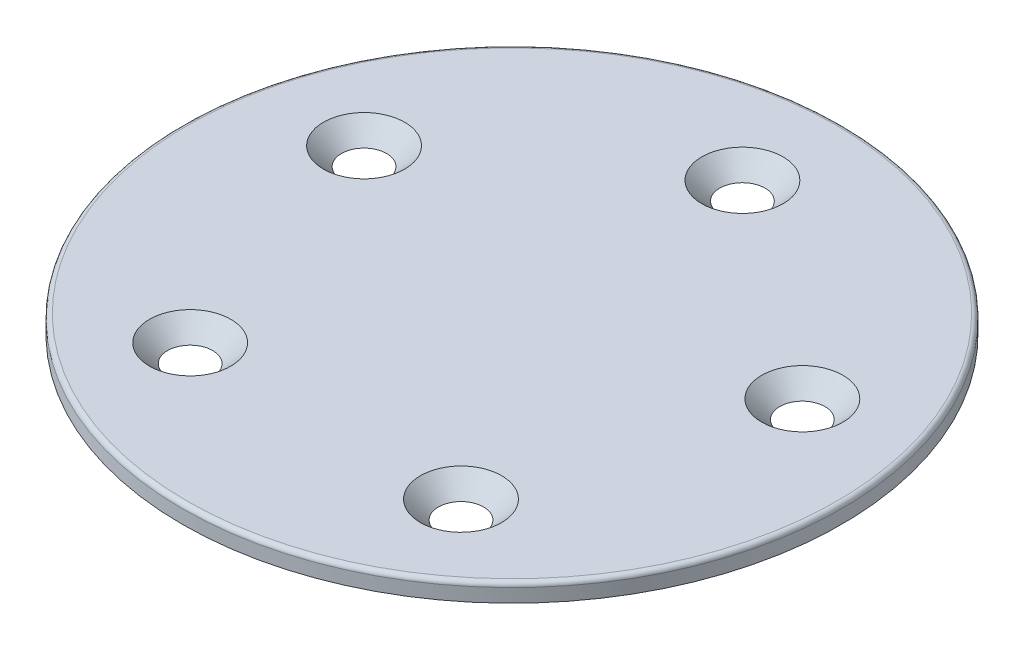
ISO-10303-21;
HEADER;
FILE_DESCRIPTION(('STEP AP214'),'2;1');
FILE_NAME('part.step','',(''),(''),'','','');
FILE_SCHEMA(('AUTOMOTIVE_DESIGN { 1 0 10303 214 1 1 1 1 }'));
ENDSEC;
DATA;
#1=APPLICATION_CONTEXT('core data for automotive mechanical design processes');
#2=APPLICATION_PROTOCOL_DEFINITION('international standard','automotive_design',2000,#1);
#3=PRODUCT_CONTEXT('',#1,'mechanical');
#4=PRODUCT('Part','Part','',(#3));
#5=PRODUCT_RELATED_PRODUCT_CATEGORY('part','',(#4));
#6=PRODUCT_DEFINITION_FORMATION('','',#4);
#7=PRODUCT_DEFINITION_CONTEXT('part definition',#1,'design');
#8=PRODUCT_DEFINITION('design','',#6,#7);
#9=PRODUCT_DEFINITION_SHAPE('','',#8);
#10=(LENGTH_UNIT() NAMED_UNIT(*) SI_UNIT(.MILLI.,.METRE.));
#11=(NAMED_UNIT(*) PLANE_ANGLE_UNIT() SI_UNIT($,.RADIAN.));
#12=(NAMED_UNIT(*) SI_UNIT($,.STERADIAN.) SOLID_ANGLE_UNIT());
#13=UNCERTAINTY_MEASURE_WITH_UNIT(LENGTH_MEASURE(1.E-05),#10,'distance_accuracy_value','');
#14=(GEOMETRIC_REPRESENTATION_CONTEXT(3) GLOBAL_UNCERTAINTY_ASSIGNED_CONTEXT((#13)) GLOBAL_UNIT_ASSIGNED_CONTEXT((#10,
#11,#12)) REPRESENTATION_CONTEXT('',''));
#15=CARTESIAN_POINT('',(0.,0.,0.));
#16=DIRECTION('',(0.,0.,1.));
#17=DIRECTION('',(1.,0.,0.));
#18=AXIS2_PLACEMENT_3D('',#15,#16,#17);
#19=CARTESIAN_POINT('',(0.,2.,0.));
#20=DIRECTION('',(0.,-1.,0.));
#21=DIRECTION('',(0.,0.,-1.));
#22=AXIS2_PLACEMENT_3D('',#19,#20,#21);
#23=CYLINDRICAL_SURFACE('',#22,36.5);
#24=CARTESIAN_POINT('',(0.,1.5,0.));
#25=DIRECTION('',(0.,1.,0.));
#26=DIRECTION('',(0.,0.,1.));
#27=AXIS2_PLACEMENT_3D('',#24,#25,#26);
#28=CIRCLE('',#27,36.5);
#29=CARTESIAN_POINT('',(0.,1.5,36.5));
#30=VERTEX_POINT('',#29);
#31=EDGE_CURVE('E10',#30,#30,#28,.F.);
#32=ORIENTED_EDGE('',*,*,#31,.T.);
#33=EDGE_LOOP('',(#32));
#34=FACE_BOUND('',#33,.T.);
#35=CARTESIAN_POINT('',(0.,0.,0.));
#36=DIRECTION('',(0.,1.,0.));
#37=DIRECTION('',(0.,0.,1.));
#38=AXIS2_PLACEMENT_3D('',#35,#36,#37);
#39=CIRCLE('',#38,36.5);
#40=CARTESIAN_POINT('',(0.,0.,36.5));
#41=VERTEX_POINT('',#40);
#42=EDGE_CURVE('E83',#41,#41,#39,.T.);
#43=ORIENTED_EDGE('',*,*,#42,.T.);
#44=EDGE_LOOP('',(#43));
#45=FACE_BOUND('',#44,.T.);
#46=ADVANCED_FACE('F47',(#34,#45),#23,.T.);
#47=CARTESIAN_POINT('',(0.,2.,0.));
#48=DIRECTION('',(0.,1.,0.));
#49=DIRECTION('',(0.,0.,1.));
#50=AXIS2_PLACEMENT_3D('',#47,#48,#49);
#51=PLANE('',#50);
#52=CARTESIAN_POINT('',(0.,2.,0.));
#53=DIRECTION('',(0.,1.,0.));
#54=DIRECTION('',(0.,0.,1.));
#55=AXIS2_PLACEMENT_3D('',#52,#53,#54);
#56=CIRCLE('',#55,36.);
#57=CARTESIAN_POINT('',(0.,2.,36.));
#58=VERTEX_POINT('',#57);
#59=EDGE_CURVE('E55',#58,#58,#56,.T.);
#60=ORIENTED_EDGE('',*,*,#59,.T.);
#61=EDGE_LOOP('',(#60));
#62=FACE_BOUND('',#61,.T.);
#63=CARTESIAN_POINT('',(-15.0002796385039,2.,20.6461136964487));
#64=DIRECTION('',(0.,1.,0.));
#65=DIRECTION('',(0.,0.,1.));
#66=AXIS2_PLACEMENT_3D('',#63,#64,#65);
#67=CIRCLE('',#66,4.50000000000004);
#68=CARTESIAN_POINT('',(-15.0002796385039,2.,25.1461136964487));
#69=VERTEX_POINT('',#68);
#70=EDGE_CURVE('E60',#69,#69,#67,.F.);
#71=ORIENTED_EDGE('',*,*,#70,.T.);
#72=EDGE_LOOP('',(#71));
#73=FACE_BOUND('',#72,.T.);
#74=CARTESIAN_POINT('',(15.0002796385039,2.,20.6461136964487));
#75=DIRECTION('',(0.,1.,0.));
#76=DIRECTION('',(0.,0.,1.));
#77=AXIS2_PLACEMENT_3D('',#74,#75,#76);
#78=CIRCLE('',#77,4.5);
#79=CARTESIAN_POINT('',(15.0002796385039,2.,25.1461136964487));
#80=VERTEX_POINT('',#79);
#81=EDGE_CURVE('E65',#80,#80,#78,.F.);
#82=ORIENTED_EDGE('',*,*,#81,.T.);
#83=EDGE_LOOP('',(#82));
#84=FACE_BOUND('',#83,.T.);
#85=CARTESIAN_POINT('',(24.2709622958523,2.,-7.88611369644866));
#86=DIRECTION('',(0.,1.,0.));
#87=DIRECTION('',(0.,0.,1.));
#88=AXIS2_PLACEMENT_3D('',#85,#86,#87);
#89=CIRCLE('',#88,4.50000000000003);
#90=CARTESIAN_POINT('',(24.2709622958523,2.,-3.38611369644863));
#91=VERTEX_POINT('',#90);
#92=EDGE_CURVE('E71',#91,#91,#89,.F.);
#93=ORIENTED_EDGE('',*,*,#92,.T.);
#94=EDGE_LOOP('',(#93));
#95=FACE_BOUND('',#94,.T.);
#96=CARTESIAN_POINT('',(0.,2.,-25.52));
#97=DIRECTION('',(0.,1.,0.));
#98=DIRECTION('',(0.,0.,1.));
#99=AXIS2_PLACEMENT_3D('',#96,#97,#98);
#100=CIRCLE('',#99,4.5);
#101=CARTESIAN_POINT('',(0.,2.,-21.02));
#102=VERTEX_POINT('',#101);
#103=EDGE_CURVE('E75',#102,#102,#100,.F.);
#104=ORIENTED_EDGE('',*,*,#103,.T.);
#105=EDGE_LOOP('',(#104));
#106=FACE_BOUND('',#105,.T.);
#107=CARTESIAN_POINT('',(-24.2709622958523,2.,-7.88611369644866));
#108=DIRECTION('',(0.,1.,0.));
#109=DIRECTION('',(0.,0.,1.));
#110=AXIS2_PLACEMENT_3D('',#107,#108,#109);
#111=CIRCLE('',#110,4.50000000000003);
#112=CARTESIAN_POINT('',(-24.2709622958523,2.,-3.38611369644863));
#113=VERTEX_POINT('',#112);
#114=EDGE_CURVE('E79',#113,#113,#111,.F.);
#115=ORIENTED_EDGE('',*,*,#114,.T.);
#116=EDGE_LOOP('',(#115));
#117=FACE_BOUND('',#116,.T.);
#118=ADVANCED_FACE('F126',(#62,#73,#84,#95,#106,#117),#51,.T.);
#119=CARTESIAN_POINT('',(0.,0.,0.));
#120=DIRECTION('',(0.,1.,0.));
#121=DIRECTION('',(0.,0.,1.));
#122=AXIS2_PLACEMENT_3D('',#119,#120,#121);
#123=PLANE('',#122);
#124=CARTESIAN_POINT('',(-24.2709622958523,0.,-7.88611369644866));
#125=DIRECTION('',(0.,1.,0.));
#126=DIRECTION('',(0.,0.,1.));
#127=AXIS2_PLACEMENT_3D('',#124,#125,#126);
#128=CIRCLE('',#127,2.5);
#129=CARTESIAN_POINT('',(-24.2709622958523,0.,-5.38611369644866));
#130=VERTEX_POINT('',#129);
#131=EDGE_CURVE('E103',#130,#130,#128,.T.);
#132=ORIENTED_EDGE('',*,*,#131,.T.);
#133=EDGE_LOOP('',(#132));
#134=FACE_BOUND('',#133,.T.);
#135=CARTESIAN_POINT('',(-15.0002796385039,0.,20.6461136964487));
#136=DIRECTION('',(0.,1.,0.));
#137=DIRECTION('',(0.,0.,1.));
#138=AXIS2_PLACEMENT_3D('',#135,#136,#137);
#139=CIRCLE('',#138,2.5);
#140=CARTESIAN_POINT('',(-15.0002796385039,0.,23.1461136964487));
#141=VERTEX_POINT('',#140);
#142=EDGE_CURVE('E99',#141,#141,#139,.T.);
#143=ORIENTED_EDGE('',*,*,#142,.T.);
#144=EDGE_LOOP('',(#143));
#145=FACE_BOUND('',#144,.T.);
#146=CARTESIAN_POINT('',(15.0002796385039,0.,20.6461136964487));
#147=DIRECTION('',(0.,1.,0.));
#148=DIRECTION('',(0.,0.,1.));
#149=AXIS2_PLACEMENT_3D('',#146,#147,#148);
#150=CIRCLE('',#149,2.5);
#151=CARTESIAN_POINT('',(15.0002796385039,0.,23.1461136964487));
#152=VERTEX_POINT('',#151);
#153=EDGE_CURVE('E95',#152,#152,#150,.T.);
#154=ORIENTED_EDGE('',*,*,#153,.T.);
#155=EDGE_LOOP('',(#154));
#156=FACE_BOUND('',#155,.T.);
#157=CARTESIAN_POINT('',(24.2709622958523,0.,-7.88611369644866));
#158=DIRECTION('',(0.,1.,0.));
#159=DIRECTION('',(0.,0.,1.));
#160=AXIS2_PLACEMENT_3D('',#157,#158,#159);
#161=CIRCLE('',#160,2.5);
#162=CARTESIAN_POINT('',(24.2709622958523,0.,-5.38611369644866));
#163=VERTEX_POINT('',#162);
#164=EDGE_CURVE('E91',#163,#163,#161,.T.);
#165=ORIENTED_EDGE('',*,*,#164,.T.);
#166=EDGE_LOOP('',(#165));
#167=FACE_BOUND('',#166,.T.);
#168=CARTESIAN_POINT('',(0.,0.,-25.52));
#169=DIRECTION('',(0.,1.,0.));
#170=DIRECTION('',(0.,0.,1.));
#171=AXIS2_PLACEMENT_3D('',#168,#169,#170);
#172=CIRCLE('',#171,2.5);
#173=CARTESIAN_POINT('',(0.,0.,-23.02));
#174=VERTEX_POINT('',#173);
#175=EDGE_CURVE('E87',#174,#174,#172,.T.);
#176=ORIENTED_EDGE('',*,*,#175,.T.);
#177=EDGE_LOOP('',(#176));
#178=FACE_BOUND('',#177,.T.);
#179=ORIENTED_EDGE('',*,*,#42,.F.);
#180=EDGE_LOOP('',(#179));
#181=FACE_BOUND('',#180,.T.);
#182=ADVANCED_FACE('F108',(#134,#145,#156,#167,#178,#181),#123,.F.);
#183=CARTESIAN_POINT('',(-15.0002796385039,0.,20.6461136964487));
#184=DIRECTION('',(0.,1.,0.));
#185=DIRECTION('',(0.,0.,1.));
#186=AXIS2_PLACEMENT_3D('',#183,#184,#185);
#187=CONICAL_SURFACE('',#186,2.5,0.785398163397449);
#188=ORIENTED_EDGE('',*,*,#70,.F.);
#189=EDGE_LOOP('',(#188));
#190=FACE_BOUND('',#189,.T.);
#191=ORIENTED_EDGE('',*,*,#142,.F.);
#192=EDGE_LOOP('',(#191));
#193=FACE_BOUND('',#192,.T.);
#194=ADVANCED_FACE('F136',(#190,#193),#187,.F.);
#195=CARTESIAN_POINT('',(15.0002796385039,0.,20.6461136964487));
#196=DIRECTION('',(0.,1.,0.));
#197=DIRECTION('',(0.,0.,1.));
#198=AXIS2_PLACEMENT_3D('',#195,#196,#197);
#199=CONICAL_SURFACE('',#198,2.5,0.785398163397448);
#200=ORIENTED_EDGE('',*,*,#81,.F.);
#201=EDGE_LOOP('',(#200));
#202=FACE_BOUND('',#201,.T.);
#203=ORIENTED_EDGE('',*,*,#153,.F.);
#204=EDGE_LOOP('',(#203));
#205=FACE_BOUND('',#204,.T.);
#206=ADVANCED_FACE('F142',(#202,#205),#199,.F.);
#207=CARTESIAN_POINT('',(24.2709622958523,0.,-7.88611369644866));
#208=DIRECTION('',(0.,1.,0.));
#209=DIRECTION('',(0.,0.,1.));
#210=AXIS2_PLACEMENT_3D('',#207,#208,#209);
#211=CONICAL_SURFACE('',#210,2.5,0.785398163397448);
#212=ORIENTED_EDGE('',*,*,#92,.F.);
#213=EDGE_LOOP('',(#212));
#214=FACE_BOUND('',#213,.T.);
#215=ORIENTED_EDGE('',*,*,#164,.F.);
#216=EDGE_LOOP('',(#215));
#217=FACE_BOUND('',#216,.T.);
#218=ADVANCED_FACE('F120',(#214,#217),#211,.F.);
#219=CARTESIAN_POINT('',(0.,0.,-25.52));
#220=DIRECTION('',(0.,1.,0.));
#221=DIRECTION('',(0.,0.,1.));
#222=AXIS2_PLACEMENT_3D('',#219,#220,#221);
#223=CONICAL_SURFACE('',#222,2.5,0.785398163397449);
#224=ORIENTED_EDGE('',*,*,#103,.F.);
#225=EDGE_LOOP('',(#224));
#226=FACE_BOUND('',#225,.T.);
#227=ORIENTED_EDGE('',*,*,#175,.F.);
#228=EDGE_LOOP('',(#227));
#229=FACE_BOUND('',#228,.T.);
#230=ADVANCED_FACE('F113',(#226,#229),#223,.F.);
#231=CARTESIAN_POINT('',(-24.2709622958523,0.,-7.88611369644866));
#232=DIRECTION('',(0.,1.,0.));
#233=DIRECTION('',(0.,0.,1.));
#234=AXIS2_PLACEMENT_3D('',#231,#232,#233);
#235=CONICAL_SURFACE('',#234,2.5,0.785398163397448);
#236=ORIENTED_EDGE('',*,*,#114,.F.);
#237=EDGE_LOOP('',(#236));
#238=FACE_BOUND('',#237,.T.);
#239=ORIENTED_EDGE('',*,*,#131,.F.);
#240=EDGE_LOOP('',(#239));
#241=FACE_BOUND('',#240,.T.);
#242=ADVANCED_FACE('F111',(#238,#241),#235,.F.);
#243=CARTESIAN_POINT('',(0.,1.5,0.));
#244=DIRECTION('',(0.,1.,0.));
#245=DIRECTION('',(0.,0.,1.));
#246=AXIS2_PLACEMENT_3D('',#243,#244,#245);
#247=TOROIDAL_SURFACE('',#246,36.,0.5);
#248=ORIENTED_EDGE('',*,*,#31,.F.);
#249=EDGE_LOOP('',(#248));
#250=FACE_BOUND('',#249,.T.);
#251=ORIENTED_EDGE('',*,*,#59,.F.);
#252=EDGE_LOOP('',(#251));
#253=FACE_BOUND('',#252,.T.);
#254=ADVANCED_FACE('F49',(#250,#253),#247,.T.);
#255=CLOSED_SHELL('',(#46,#118,#182,#194,#206,#218,#230,#242,#254));
#256=MANIFOLD_SOLID_BREP('B2',#255);
#257=ADVANCED_BREP_SHAPE_REPRESENTATION('',(#18,#256),#14);
#258=SHAPE_DEFINITION_REPRESENTATION(#9,#257);
ENDSEC;
END-ISO-10303-21;
